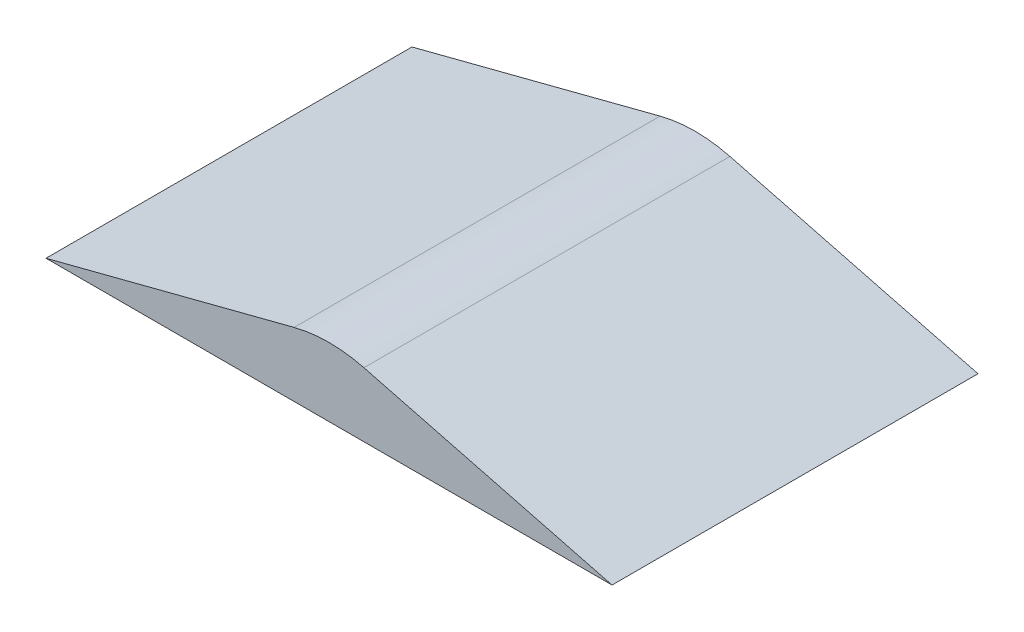
ISO-10303-21;
HEADER;
FILE_DESCRIPTION(('STEP AP214'),'2;1');
FILE_NAME('part.step','',(''),(''),'','','');
FILE_SCHEMA(('AUTOMOTIVE_DESIGN { 1 0 10303 214 1 1 1 1 }'));
ENDSEC;
DATA;
#1=APPLICATION_CONTEXT('core data for automotive mechanical design processes');
#2=APPLICATION_PROTOCOL_DEFINITION('international standard','automotive_design',2000,#1);
#3=PRODUCT_CONTEXT('',#1,'mechanical');
#4=PRODUCT('Part','Part','',(#3));
#5=PRODUCT_RELATED_PRODUCT_CATEGORY('part','',(#4));
#6=PRODUCT_DEFINITION_FORMATION('','',#4);
#7=PRODUCT_DEFINITION_CONTEXT('part definition',#1,'design');
#8=PRODUCT_DEFINITION('design','',#6,#7);
#9=PRODUCT_DEFINITION_SHAPE('','',#8);
#10=(LENGTH_UNIT() NAMED_UNIT(*) SI_UNIT(.MILLI.,.METRE.));
#11=(NAMED_UNIT(*) PLANE_ANGLE_UNIT() SI_UNIT($,.RADIAN.));
#12=(NAMED_UNIT(*) SI_UNIT($,.STERADIAN.) SOLID_ANGLE_UNIT());
#13=UNCERTAINTY_MEASURE_WITH_UNIT(LENGTH_MEASURE(1.E-05),#10,'distance_accuracy_value','');
#14=(GEOMETRIC_REPRESENTATION_CONTEXT(3) GLOBAL_UNCERTAINTY_ASSIGNED_CONTEXT((#13)) GLOBAL_UNIT_ASSIGNED_CONTEXT((#10,
#11,#12)) REPRESENTATION_CONTEXT('',''));
#15=CARTESIAN_POINT('',(0.,0.,0.));
#16=DIRECTION('',(0.,0.,1.));
#17=DIRECTION('',(1.,0.,0.));
#18=AXIS2_PLACEMENT_3D('',#15,#16,#17);
#19=CARTESIAN_POINT('',(-151.256685576179,-7.69191692837294,200.));
#20=DIRECTION('',(0.,1.,0.));
#21=DIRECTION('',(-1.,0.,0.));
#22=AXIS2_PLACEMENT_3D('',#19,#20,#21);
#23=PLANE('',#22);
#24=DIRECTION('',(1.,0.,0.));
#25=VECTOR('',#24,1.);
#26=CARTESIAN_POINT('',(-151.256685576179,-7.69191692837294,0.));
#27=LINE('',#26,#25);
#28=CARTESIAN_POINT('',(-151.256685576179,-7.69191692837294,0.));
#29=VERTEX_POINT('',#28);
#30=CARTESIAN_POINT('',(158.080362015719,-7.69191692837294,0.));
#31=VERTEX_POINT('',#30);
#32=EDGE_CURVE('E146',#29,#31,#27,.T.);
#33=ORIENTED_EDGE('',*,*,#32,.T.);
#34=DIRECTION('',(0.,0.,-1.));
#35=VECTOR('',#34,1.);
#36=CARTESIAN_POINT('',(158.080362015719,-7.69191692837294,200.));
#37=LINE('',#36,#35);
#38=CARTESIAN_POINT('',(158.080362015719,-7.69191692837294,200.));
#39=VERTEX_POINT('',#38);
#40=EDGE_CURVE('E11',#39,#31,#37,.T.);
#41=ORIENTED_EDGE('',*,*,#40,.F.);
#42=DIRECTION('',(1.,0.,0.));
#43=VECTOR('',#42,1.);
#44=CARTESIAN_POINT('',(-151.256685576179,-7.69191692837294,200.));
#45=LINE('',#44,#43);
#46=CARTESIAN_POINT('',(-151.256685576179,-7.69191692837294,200.));
#47=VERTEX_POINT('',#46);
#48=EDGE_CURVE('E151',#47,#39,#45,.T.);
#49=ORIENTED_EDGE('',*,*,#48,.F.);
#50=DIRECTION('',(0.,0.,-1.));
#51=VECTOR('',#50,1.);
#52=CARTESIAN_POINT('',(-151.256685576179,-7.69191692837294,200.));
#53=LINE('',#52,#51);
#54=EDGE_CURVE('E157',#47,#29,#53,.T.);
#55=ORIENTED_EDGE('',*,*,#54,.T.);
#56=EDGE_LOOP('',(#33,#41,#49,#55));
#57=FACE_BOUND('',#56,.T.);
#58=DIRECTION('',(1.,0.,0.));
#59=VECTOR('',#58,1.);
#60=CARTESIAN_POINT('',(-151.256685576179,-7.69191692837294,17.));
#61=LINE('',#60,#59);
#62=CARTESIAN_POINT('',(-83.3598898068832,-7.69191692837294,17.));
#63=VERTEX_POINT('',#62);
#64=CARTESIAN_POINT('',(90.1835662464226,-7.69191692837294,17.));
#65=VERTEX_POINT('',#64);
#66=EDGE_CURVE('E117',#63,#65,#61,.T.);
#67=ORIENTED_EDGE('',*,*,#66,.F.);
#68=DIRECTION('',(0.,0.,-1.));
#69=VECTOR('',#68,1.);
#70=CARTESIAN_POINT('',(-83.3598898068832,-7.69191692837294,200.));
#71=LINE('',#70,#69);
#72=CARTESIAN_POINT('',(-83.3598898068832,-7.69191692837294,183.));
#73=VERTEX_POINT('',#72);
#74=EDGE_CURVE('E140',#73,#63,#71,.T.);
#75=ORIENTED_EDGE('',*,*,#74,.F.);
#76=DIRECTION('',(1.,0.,0.));
#77=VECTOR('',#76,1.);
#78=CARTESIAN_POINT('',(-151.256685576179,-7.69191692837294,183.));
#79=LINE('',#78,#77);
#80=CARTESIAN_POINT('',(90.1835662464226,-7.69191692837294,183.));
#81=VERTEX_POINT('',#80);
#82=EDGE_CURVE('E51',#73,#81,#79,.T.);
#83=ORIENTED_EDGE('',*,*,#82,.T.);
#84=DIRECTION('',(0.,0.,-1.));
#85=VECTOR('',#84,1.);
#86=CARTESIAN_POINT('',(90.1835662464226,-7.69191692837294,200.));
#87=LINE('',#86,#85);
#88=EDGE_CURVE('E128',#81,#65,#87,.T.);
#89=ORIENTED_EDGE('',*,*,#88,.T.);
#90=EDGE_LOOP('',(#67,#75,#83,#89));
#91=FACE_BOUND('',#90,.T.);
#92=ADVANCED_FACE('F37',(#57,#91),#23,.F.);
#93=CARTESIAN_POINT('',(22.4907945287185,27.3739294789751,200.));
#94=DIRECTION('',(-0.250380004054442,-0.968147640378108,0.));
#95=DIRECTION('',(0.968147640378108,-0.250380004054442,0.));
#96=AXIS2_PLACEMENT_3D('',#93,#94,#95);
#97=PLANE('',#96);
#98=DIRECTION('',(-0.968147640378108,0.250380004054442,0.));
#99=VECTOR('',#98,1.);
#100=CARTESIAN_POINT('',(22.4907945287185,27.3739294789751,0.));
#101=LINE('',#100,#99);
#102=CARTESIAN_POINT('',(22.4907945287185,27.3739294789752,0.));
#103=VERTEX_POINT('',#102);
#104=EDGE_CURVE('E160',#31,#103,#101,.T.);
#105=ORIENTED_EDGE('',*,*,#104,.T.);
#106=DIRECTION('',(0.,0.,-1.));
#107=VECTOR('',#106,1.);
#108=CARTESIAN_POINT('',(22.4907945287185,27.3739294789752,200.));
#109=LINE('',#108,#107);
#110=CARTESIAN_POINT('',(22.4907945287185,27.3739294789752,200.));
#111=VERTEX_POINT('',#110);
#112=EDGE_CURVE('E44',#111,#103,#109,.T.);
#113=ORIENTED_EDGE('',*,*,#112,.F.);
#114=DIRECTION('',(-0.968147640378108,0.250380004054442,0.));
#115=VECTOR('',#114,1.);
#116=CARTESIAN_POINT('',(22.4907945287185,27.3739294789751,200.));
#117=LINE('',#116,#115);
#118=EDGE_CURVE('E88',#39,#111,#117,.T.);
#119=ORIENTED_EDGE('',*,*,#118,.F.);
#120=ORIENTED_EDGE('',*,*,#40,.T.);
#121=EDGE_LOOP('',(#105,#113,#119,#120));
#122=FACE_BOUND('',#121,.T.);
#123=ADVANCED_FACE('F189',(#122),#97,.F.);
#124=CARTESIAN_POINT('',(3.41183821976968,-46.3989207178366,200.));
#125=DIRECTION('',(0.,0.,-1.));
#126=DIRECTION('',(-1.,0.,0.));
#127=AXIS2_PLACEMENT_3D('',#124,#125,#126);
#128=CYLINDRICAL_SURFACE('',#127,76.2);
#129=CARTESIAN_POINT('',(3.41183821976968,-46.3989207178366,0.));
#130=DIRECTION('',(0.,0.,1.));
#131=DIRECTION('',(1.,0.,0.));
#132=AXIS2_PLACEMENT_3D('',#129,#130,#131);
#133=CIRCLE('',#132,76.2);
#134=CARTESIAN_POINT('',(-15.6671180891791,27.3739294789751,0.));
#135=VERTEX_POINT('',#134);
#136=EDGE_CURVE('E162',#103,#135,#133,.T.);
#137=ORIENTED_EDGE('',*,*,#136,.T.);
#138=DIRECTION('',(0.,0.,-1.));
#139=VECTOR('',#138,1.);
#140=CARTESIAN_POINT('',(-15.6671180891791,27.3739294789751,200.));
#141=LINE('',#140,#139);
#142=CARTESIAN_POINT('',(-15.6671180891791,27.3739294789751,200.));
#143=VERTEX_POINT('',#142);
#144=EDGE_CURVE('E166',#143,#135,#141,.T.);
#145=ORIENTED_EDGE('',*,*,#144,.F.);
#146=CARTESIAN_POINT('',(3.41183821976968,-46.3989207178366,200.));
#147=DIRECTION('',(0.,0.,1.));
#148=DIRECTION('',(1.,0.,0.));
#149=AXIS2_PLACEMENT_3D('',#146,#147,#148);
#150=CIRCLE('',#149,76.2);
#151=EDGE_CURVE('E154',#111,#143,#150,.T.);
#152=ORIENTED_EDGE('',*,*,#151,.F.);
#153=ORIENTED_EDGE('',*,*,#112,.T.);
#154=EDGE_LOOP('',(#137,#145,#152,#153));
#155=FACE_BOUND('',#154,.T.);
#156=ADVANCED_FACE('F171',(#155),#128,.T.);
#157=CARTESIAN_POINT('',(-151.256685576179,-7.69191692837294,200.));
#158=DIRECTION('',(0.250380004054442,-0.968147640378108,0.));
#159=DIRECTION('',(0.968147640378108,0.250380004054442,0.));
#160=AXIS2_PLACEMENT_3D('',#157,#158,#159);
#161=PLANE('',#160);
#162=DIRECTION('',(-0.968147640378108,-0.250380004054442,0.));
#163=VECTOR('',#162,1.);
#164=CARTESIAN_POINT('',(-151.256685576179,-7.69191692837294,0.));
#165=LINE('',#164,#163);
#166=EDGE_CURVE('E81',#135,#29,#165,.T.);
#167=ORIENTED_EDGE('',*,*,#166,.T.);
#168=ORIENTED_EDGE('',*,*,#54,.F.);
#169=DIRECTION('',(-0.968147640378108,-0.250380004054442,0.));
#170=VECTOR('',#169,1.);
#171=CARTESIAN_POINT('',(-151.256685576179,-7.69191692837294,200.));
#172=LINE('',#171,#170);
#173=EDGE_CURVE('E60',#143,#47,#172,.T.);
#174=ORIENTED_EDGE('',*,*,#173,.F.);
#175=ORIENTED_EDGE('',*,*,#144,.T.);
#176=EDGE_LOOP('',(#167,#168,#174,#175));
#177=FACE_BOUND('',#176,.T.);
#178=ADVANCED_FACE('F180',(#177),#161,.F.);
#179=CARTESIAN_POINT('',(3.41183821976968,-46.3989207178366,200.));
#180=DIRECTION('',(0.,0.,1.));
#181=DIRECTION('',(1.,0.,0.));
#182=AXIS2_PLACEMENT_3D('',#179,#180,#181);
#183=PLANE('',#182);
#184=ORIENTED_EDGE('',*,*,#48,.T.);
#185=ORIENTED_EDGE('',*,*,#118,.T.);
#186=ORIENTED_EDGE('',*,*,#151,.T.);
#187=ORIENTED_EDGE('',*,*,#173,.T.);
#188=EDGE_LOOP('',(#184,#185,#186,#187));
#189=FACE_BOUND('',#188,.T.);
#190=ADVANCED_FACE('F182',(#189),#183,.T.);
#191=CARTESIAN_POINT('',(3.41183821976968,-46.3989207178366,0.));
#192=DIRECTION('',(0.,0.,1.));
#193=DIRECTION('',(1.,0.,0.));
#194=AXIS2_PLACEMENT_3D('',#191,#192,#193);
#195=PLANE('',#194);
#196=ORIENTED_EDGE('',*,*,#32,.F.);
#197=ORIENTED_EDGE('',*,*,#166,.F.);
#198=ORIENTED_EDGE('',*,*,#136,.F.);
#199=ORIENTED_EDGE('',*,*,#104,.F.);
#200=EDGE_LOOP('',(#196,#197,#198,#199));
#201=FACE_BOUND('',#200,.T.);
#202=ADVANCED_FACE('F175',(#201),#195,.F.);
#203=CARTESIAN_POINT('',(18.2343344597929,10.9154195925473,200.));
#204=DIRECTION('',(-0.250380004054442,-0.968147640378108,0.));
#205=DIRECTION('',(0.968147640378108,-0.250380004054442,0.));
#206=AXIS2_PLACEMENT_3D('',#203,#204,#205);
#207=PLANE('',#206);
#208=DIRECTION('',(-0.968147640378108,0.250380004054442,0.));
#209=VECTOR('',#208,1.);
#210=CARTESIAN_POINT('',(18.2343344597929,10.9154195925473,17.));
#211=LINE('',#210,#209);
#212=CARTESIAN_POINT('',(18.2343344597929,10.9154195925473,17.));
#213=VERTEX_POINT('',#212);
#214=EDGE_CURVE('E110',#65,#213,#211,.T.);
#215=ORIENTED_EDGE('',*,*,#214,.F.);
#216=ORIENTED_EDGE('',*,*,#88,.F.);
#217=DIRECTION('',(-0.968147640378108,0.250380004054442,0.));
#218=VECTOR('',#217,1.);
#219=CARTESIAN_POINT('',(18.2343344597929,10.9154195925473,183.));
#220=LINE('',#219,#218);
#221=CARTESIAN_POINT('',(18.2343344597929,10.9154195925473,183.));
#222=VERTEX_POINT('',#221);
#223=EDGE_CURVE('E125',#81,#222,#220,.T.);
#224=ORIENTED_EDGE('',*,*,#223,.T.);
#225=DIRECTION('',(0.,0.,-1.));
#226=VECTOR('',#225,1.);
#227=CARTESIAN_POINT('',(18.2343344597929,10.9154195925473,200.));
#228=LINE('',#227,#226);
#229=EDGE_CURVE('E123',#222,#213,#228,.T.);
#230=ORIENTED_EDGE('',*,*,#229,.T.);
#231=EDGE_LOOP('',(#215,#216,#224,#230));
#232=FACE_BOUND('',#231,.T.);
#233=ADVANCED_FACE('F124',(#232),#207,.T.);
#234=CARTESIAN_POINT('',(3.41183821976968,-46.3989207178366,200.));
#235=DIRECTION('',(0.,0.,-1.));
#236=DIRECTION('',(-1.,0.,0.));
#237=AXIS2_PLACEMENT_3D('',#234,#235,#236);
#238=CYLINDRICAL_SURFACE('',#237,59.2);
#239=CARTESIAN_POINT('',(3.41183821976968,-46.3989207178366,17.));
#240=DIRECTION('',(0.,0.,1.));
#241=DIRECTION('',(1.,0.,0.));
#242=AXIS2_PLACEMENT_3D('',#239,#240,#241);
#243=CIRCLE('',#242,59.2);
#244=CARTESIAN_POINT('',(-11.4106580202535,10.9154195925473,17.));
#245=VERTEX_POINT('',#244);
#246=EDGE_CURVE('E114',#213,#245,#243,.T.);
#247=ORIENTED_EDGE('',*,*,#246,.F.);
#248=ORIENTED_EDGE('',*,*,#229,.F.);
#249=CARTESIAN_POINT('',(3.41183821976968,-46.3989207178366,183.));
#250=DIRECTION('',(0.,0.,1.));
#251=DIRECTION('',(1.,0.,0.));
#252=AXIS2_PLACEMENT_3D('',#249,#250,#251);
#253=CIRCLE('',#252,59.2);
#254=CARTESIAN_POINT('',(-11.4106580202535,10.9154195925473,183.));
#255=VERTEX_POINT('',#254);
#256=EDGE_CURVE('E141',#222,#255,#253,.T.);
#257=ORIENTED_EDGE('',*,*,#256,.T.);
#258=DIRECTION('',(0.,0.,1.));
#259=VECTOR('',#258,1.);
#260=CARTESIAN_POINT('',(-11.4106580202535,10.9154195925473,200.));
#261=LINE('',#260,#259);
#262=EDGE_CURVE('E129',#255,#245,#261,.F.);
#263=ORIENTED_EDGE('',*,*,#262,.T.);
#264=EDGE_LOOP('',(#247,#248,#257,#263));
#265=FACE_BOUND('',#264,.T.);
#266=ADVANCED_FACE('F131',(#265),#238,.F.);
#267=CARTESIAN_POINT('',(-147.000225507254,-24.1504268148008,200.));
#268=DIRECTION('',(0.250380004054442,-0.968147640378108,0.));
#269=DIRECTION('',(0.968147640378108,0.250380004054442,0.));
#270=AXIS2_PLACEMENT_3D('',#267,#268,#269);
#271=PLANE('',#270);
#272=DIRECTION('',(-0.968147640378108,-0.250380004054442,0.));
#273=VECTOR('',#272,1.);
#274=CARTESIAN_POINT('',(-147.000225507254,-24.1504268148008,17.));
#275=LINE('',#274,#273);
#276=EDGE_CURVE('E134',#245,#63,#275,.T.);
#277=ORIENTED_EDGE('',*,*,#276,.F.);
#278=ORIENTED_EDGE('',*,*,#262,.F.);
#279=DIRECTION('',(-0.968147640378108,-0.250380004054442,0.));
#280=VECTOR('',#279,1.);
#281=CARTESIAN_POINT('',(-147.000225507254,-24.1504268148008,183.));
#282=LINE('',#281,#280);
#283=EDGE_CURVE('E142',#255,#73,#282,.T.);
#284=ORIENTED_EDGE('',*,*,#283,.T.);
#285=ORIENTED_EDGE('',*,*,#74,.T.);
#286=EDGE_LOOP('',(#277,#278,#284,#285));
#287=FACE_BOUND('',#286,.T.);
#288=ADVANCED_FACE('F240',(#287),#271,.T.);
#289=CARTESIAN_POINT('',(3.41183821976968,-46.3989207178366,183.));
#290=DIRECTION('',(0.,0.,1.));
#291=DIRECTION('',(1.,0.,0.));
#292=AXIS2_PLACEMENT_3D('',#289,#290,#291);
#293=PLANE('',#292);
#294=ORIENTED_EDGE('',*,*,#82,.F.);
#295=ORIENTED_EDGE('',*,*,#283,.F.);
#296=ORIENTED_EDGE('',*,*,#256,.F.);
#297=ORIENTED_EDGE('',*,*,#223,.F.);
#298=EDGE_LOOP('',(#294,#295,#296,#297));
#299=FACE_BOUND('',#298,.T.);
#300=ADVANCED_FACE('F249',(#299),#293,.F.);
#301=CARTESIAN_POINT('',(3.41183821976968,-46.3989207178366,17.));
#302=DIRECTION('',(0.,0.,1.));
#303=DIRECTION('',(1.,0.,0.));
#304=AXIS2_PLACEMENT_3D('',#301,#302,#303);
#305=PLANE('',#304);
#306=ORIENTED_EDGE('',*,*,#66,.T.);
#307=ORIENTED_EDGE('',*,*,#214,.T.);
#308=ORIENTED_EDGE('',*,*,#246,.T.);
#309=ORIENTED_EDGE('',*,*,#276,.T.);
#310=EDGE_LOOP('',(#306,#307,#308,#309));
#311=FACE_BOUND('',#310,.T.);
#312=ADVANCED_FACE('F112',(#311),#305,.T.);
#313=CLOSED_SHELL('',(#92,#123,#156,#178,#190,#202,#233,#266,#288,#300,#312));
#314=MANIFOLD_SOLID_BREP('B2',#313);
#315=ADVANCED_BREP_SHAPE_REPRESENTATION('',(#18,#314),#14);
#316=SHAPE_DEFINITION_REPRESENTATION(#9,#315);
ENDSEC;
END-ISO-10303-21;
